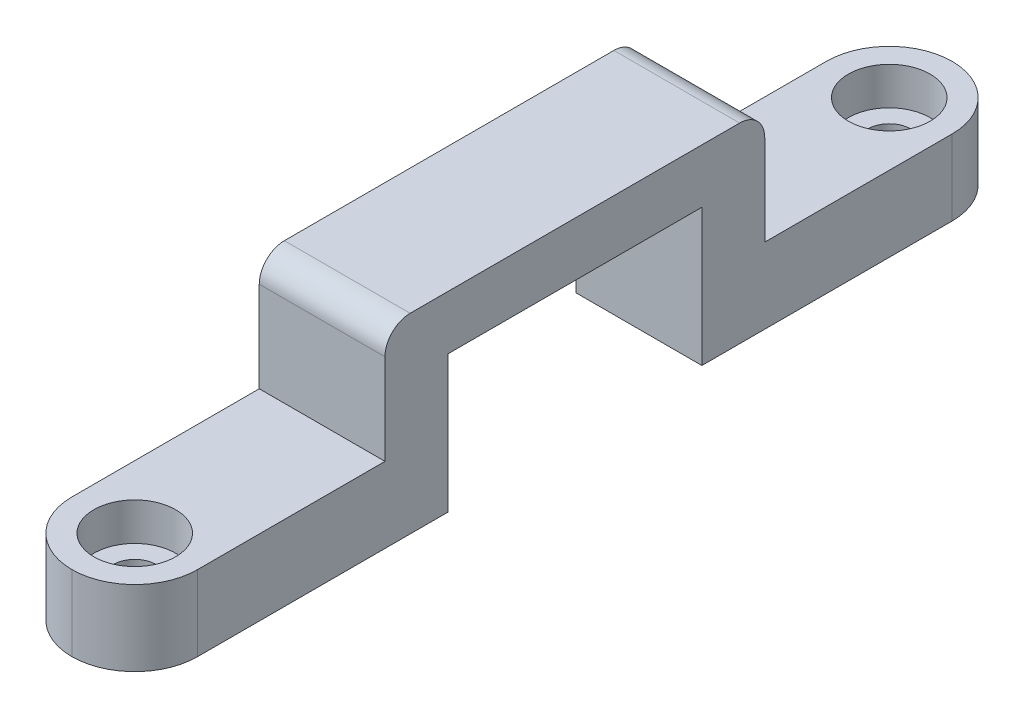
ISO-10303-21;
HEADER;
FILE_DESCRIPTION(('STEP AP214'),'2;1');
FILE_NAME('part.step','',(''),(''),'','','');
FILE_SCHEMA(('AUTOMOTIVE_DESIGN { 1 0 10303 214 1 1 1 1 }'));
ENDSEC;
DATA;
#1=APPLICATION_CONTEXT('core data for automotive mechanical design processes');
#2=APPLICATION_PROTOCOL_DEFINITION('international standard','automotive_design',2000,#1);
#3=PRODUCT_CONTEXT('',#1,'mechanical');
#4=PRODUCT('Part','Part','',(#3));
#5=PRODUCT_RELATED_PRODUCT_CATEGORY('part','',(#4));
#6=PRODUCT_DEFINITION_FORMATION('','',#4);
#7=PRODUCT_DEFINITION_CONTEXT('part definition',#1,'design');
#8=PRODUCT_DEFINITION('design','',#6,#7);
#9=PRODUCT_DEFINITION_SHAPE('','',#8);
#10=(LENGTH_UNIT() NAMED_UNIT(*) SI_UNIT(.MILLI.,.METRE.));
#11=(NAMED_UNIT(*) PLANE_ANGLE_UNIT() SI_UNIT($,.RADIAN.));
#12=(NAMED_UNIT(*) SI_UNIT($,.STERADIAN.) SOLID_ANGLE_UNIT());
#13=UNCERTAINTY_MEASURE_WITH_UNIT(LENGTH_MEASURE(1.E-05),#10,'distance_accuracy_value','');
#14=(GEOMETRIC_REPRESENTATION_CONTEXT(3) GLOBAL_UNCERTAINTY_ASSIGNED_CONTEXT((#13)) GLOBAL_UNIT_ASSIGNED_CONTEXT((#10,
#11,#12)) REPRESENTATION_CONTEXT('',''));
#15=CARTESIAN_POINT('',(0.,0.,0.));
#16=DIRECTION('',(0.,0.,1.));
#17=DIRECTION('',(1.,0.,0.));
#18=AXIS2_PLACEMENT_3D('',#15,#16,#17);
#19=CARTESIAN_POINT('',(10.,0.,-70.));
#20=DIRECTION('',(0.,1.,0.));
#21=DIRECTION('',(0.,0.,1.));
#22=AXIS2_PLACEMENT_3D('',#19,#20,#21);
#23=PLANE('',#22);
#24=CARTESIAN_POINT('',(5.,0.,-5.));
#25=DIRECTION('',(0.,1.,0.));
#26=DIRECTION('',(0.,0.,1.));
#27=AXIS2_PLACEMENT_3D('',#24,#25,#26);
#28=CIRCLE('',#27,1.7);
#29=CARTESIAN_POINT('',(5.,0.,-3.3));
#30=VERTEX_POINT('',#29);
#31=EDGE_CURVE('E222',#30,#30,#28,.T.);
#32=ORIENTED_EDGE('',*,*,#31,.T.);
#33=EDGE_LOOP('',(#32));
#34=FACE_BOUND('',#33,.T.);
#35=DIRECTION('',(0.,0.,-1.));
#36=VECTOR('',#35,1.);
#37=CARTESIAN_POINT('',(10.,0.,-70.));
#38=LINE('',#37,#36);
#39=CARTESIAN_POINT('',(10.,0.,-5.));
#40=VERTEX_POINT('',#39);
#41=CARTESIAN_POINT('',(10.,0.,-24.9));
#42=VERTEX_POINT('',#41);
#43=EDGE_CURVE('E242',#40,#42,#38,.T.);
#44=ORIENTED_EDGE('',*,*,#43,.F.);
#45=CARTESIAN_POINT('',(5.,0.,-5.));
#46=DIRECTION('',(0.,1.,0.));
#47=DIRECTION('',(0.,0.,1.));
#48=AXIS2_PLACEMENT_3D('',#45,#46,#47);
#49=CIRCLE('',#48,5.);
#50=CARTESIAN_POINT('',(5.,0.,0.));
#51=VERTEX_POINT('',#50);
#52=EDGE_CURVE('E295',#40,#51,#49,.F.);
#53=ORIENTED_EDGE('',*,*,#52,.T.);
#54=CARTESIAN_POINT('',(5.,0.,-5.));
#55=DIRECTION('',(0.,1.,0.));
#56=DIRECTION('',(0.,0.,1.));
#57=AXIS2_PLACEMENT_3D('',#54,#55,#56);
#58=CIRCLE('',#57,5.);
#59=CARTESIAN_POINT('',(0.,0.,-5.));
#60=VERTEX_POINT('',#59);
#61=EDGE_CURVE('E160',#51,#60,#58,.F.);
#62=ORIENTED_EDGE('',*,*,#61,.T.);
#63=DIRECTION('',(0.,0.,-1.));
#64=VECTOR('',#63,1.);
#65=CARTESIAN_POINT('',(0.,0.,-70.));
#66=LINE('',#65,#64);
#67=CARTESIAN_POINT('',(0.,0.,-24.9));
#68=VERTEX_POINT('',#67);
#69=EDGE_CURVE('E155',#60,#68,#66,.T.);
#70=ORIENTED_EDGE('',*,*,#69,.T.);
#71=DIRECTION('',(1.,0.,0.));
#72=VECTOR('',#71,1.);
#73=CARTESIAN_POINT('',(0.,0.,-24.9));
#74=LINE('',#73,#72);
#75=EDGE_CURVE('E158',#68,#42,#74,.T.);
#76=ORIENTED_EDGE('',*,*,#75,.T.);
#77=EDGE_LOOP('',(#44,#53,#62,#70,#76));
#78=FACE_BOUND('',#77,.T.);
#79=ADVANCED_FACE('F39',(#34,#78),#23,.F.);
#80=CARTESIAN_POINT('',(5.,0.,-65.));
#81=DIRECTION('',(0.,1.,0.));
#82=DIRECTION('',(0.,0.,1.));
#83=AXIS2_PLACEMENT_3D('',#80,#81,#82);
#84=CIRCLE('',#83,1.7);
#85=CARTESIAN_POINT('',(5.,0.,-63.3));
#86=VERTEX_POINT('',#85);
#87=EDGE_CURVE('E238',#86,#86,#84,.T.);
#88=ORIENTED_EDGE('',*,*,#87,.T.);
#89=EDGE_LOOP('',(#88));
#90=FACE_BOUND('',#89,.T.);
#91=CARTESIAN_POINT('',(5.,0.,-65.));
#92=DIRECTION('',(0.,1.,0.));
#93=DIRECTION('',(0.,0.,1.));
#94=AXIS2_PLACEMENT_3D('',#91,#92,#93);
#95=CIRCLE('',#94,5.);
#96=CARTESIAN_POINT('',(0.,0.,-65.));
#97=VERTEX_POINT('',#96);
#98=CARTESIAN_POINT('',(5.,0.,-70.));
#99=VERTEX_POINT('',#98);
#100=EDGE_CURVE('E316',#97,#99,#95,.F.);
#101=ORIENTED_EDGE('',*,*,#100,.T.);
#102=CARTESIAN_POINT('',(5.,0.,-65.));
#103=DIRECTION('',(0.,1.,0.));
#104=DIRECTION('',(0.,0.,1.));
#105=AXIS2_PLACEMENT_3D('',#102,#103,#104);
#106=CIRCLE('',#105,5.);
#107=CARTESIAN_POINT('',(10.,0.,-65.));
#108=VERTEX_POINT('',#107);
#109=EDGE_CURVE('E319',#99,#108,#106,.F.);
#110=ORIENTED_EDGE('',*,*,#109,.T.);
#111=CARTESIAN_POINT('',(10.,0.,-45.1));
#112=VERTEX_POINT('',#111);
#113=EDGE_CURVE('E246',#112,#108,#38,.T.);
#114=ORIENTED_EDGE('',*,*,#113,.F.);
#115=DIRECTION('',(1.,0.,0.));
#116=VECTOR('',#115,1.);
#117=CARTESIAN_POINT('',(0.,0.,-45.1));
#118=LINE('',#117,#116);
#119=CARTESIAN_POINT('',(0.,0.,-45.1));
#120=VERTEX_POINT('',#119);
#121=EDGE_CURVE('E177',#120,#112,#118,.T.);
#122=ORIENTED_EDGE('',*,*,#121,.F.);
#123=EDGE_CURVE('E166',#120,#97,#66,.T.);
#124=ORIENTED_EDGE('',*,*,#123,.T.);
#125=EDGE_LOOP('',(#101,#110,#114,#122,#124));
#126=FACE_BOUND('',#125,.T.);
#127=ADVANCED_FACE('F382',(#90,#126),#23,.F.);
#128=CARTESIAN_POINT('',(10.,6.,-50.1));
#129=DIRECTION('',(0.,-1.,0.));
#130=DIRECTION('',(0.,0.,-1.));
#131=AXIS2_PLACEMENT_3D('',#128,#129,#130);
#132=PLANE('',#131);
#133=CARTESIAN_POINT('',(5.,6.,-65.));
#134=DIRECTION('',(0.,1.,0.));
#135=DIRECTION('',(0.,0.,1.));
#136=AXIS2_PLACEMENT_3D('',#133,#134,#135);
#137=CIRCLE('',#136,3.25);
#138=CARTESIAN_POINT('',(5.,6.,-61.75));
#139=VERTEX_POINT('',#138);
#140=EDGE_CURVE('E226',#139,#139,#137,.T.);
#141=ORIENTED_EDGE('',*,*,#140,.F.);
#142=EDGE_LOOP('',(#141));
#143=FACE_BOUND('',#142,.T.);
#144=DIRECTION('',(0.,0.,1.));
#145=VECTOR('',#144,1.);
#146=CARTESIAN_POINT('',(10.,6.,-50.1));
#147=LINE('',#146,#145);
#148=CARTESIAN_POINT('',(10.,6.,-65.));
#149=VERTEX_POINT('',#148);
#150=CARTESIAN_POINT('',(10.,6.,-50.1));
#151=VERTEX_POINT('',#150);
#152=EDGE_CURVE('E245',#149,#151,#147,.T.);
#153=ORIENTED_EDGE('',*,*,#152,.F.);
#154=CARTESIAN_POINT('',(5.,6.,-65.));
#155=DIRECTION('',(0.,-1.,0.));
#156=DIRECTION('',(0.,0.,-1.));
#157=AXIS2_PLACEMENT_3D('',#154,#155,#156);
#158=CIRCLE('',#157,5.);
#159=CARTESIAN_POINT('',(5.,6.,-70.));
#160=VERTEX_POINT('',#159);
#161=EDGE_CURVE('E313',#149,#160,#158,.F.);
#162=ORIENTED_EDGE('',*,*,#161,.T.);
#163=CARTESIAN_POINT('',(5.,6.,-65.));
#164=DIRECTION('',(0.,-1.,0.));
#165=DIRECTION('',(0.,0.,-1.));
#166=AXIS2_PLACEMENT_3D('',#163,#164,#165);
#167=CIRCLE('',#166,5.);
#168=CARTESIAN_POINT('',(0.,6.,-65.));
#169=VERTEX_POINT('',#168);
#170=EDGE_CURVE('E310',#160,#169,#167,.F.);
#171=ORIENTED_EDGE('',*,*,#170,.T.);
#172=DIRECTION('',(0.,0.,1.));
#173=VECTOR('',#172,1.);
#174=CARTESIAN_POINT('',(0.,6.,-50.1));
#175=LINE('',#174,#173);
#176=CARTESIAN_POINT('',(0.,6.,-50.1));
#177=VERTEX_POINT('',#176);
#178=EDGE_CURVE('E165',#169,#177,#175,.T.);
#179=ORIENTED_EDGE('',*,*,#178,.T.);
#180=DIRECTION('',(-1.,0.,0.));
#181=VECTOR('',#180,1.);
#182=CARTESIAN_POINT('',(10.,6.,-50.1));
#183=LINE('',#182,#181);
#184=EDGE_CURVE('E281',#151,#177,#183,.T.);
#185=ORIENTED_EDGE('',*,*,#184,.F.);
#186=EDGE_LOOP('',(#153,#162,#171,#179,#185));
#187=FACE_BOUND('',#186,.T.);
#188=ADVANCED_FACE('F371',(#143,#187),#132,.F.);
#189=CARTESIAN_POINT('',(10.,15.2,-50.1));
#190=DIRECTION('',(0.,0.,1.));
#191=DIRECTION('',(1.,0.,0.));
#192=AXIS2_PLACEMENT_3D('',#189,#190,#191);
#193=PLANE('',#192);
#194=DIRECTION('',(0.,1.,0.));
#195=VECTOR('',#194,1.);
#196=CARTESIAN_POINT('',(0.,15.2,-50.1));
#197=LINE('',#196,#195);
#198=CARTESIAN_POINT('',(0.,13.2,-50.1));
#199=VERTEX_POINT('',#198);
#200=EDGE_CURVE('E265',#177,#199,#197,.T.);
#201=ORIENTED_EDGE('',*,*,#200,.T.);
#202=DIRECTION('',(-1.,0.,0.));
#203=VECTOR('',#202,1.);
#204=CARTESIAN_POINT('',(10.,13.2,-50.1));
#205=LINE('',#204,#203);
#206=CARTESIAN_POINT('',(10.,13.2,-50.1));
#207=VERTEX_POINT('',#206);
#208=EDGE_CURVE('E11',#199,#207,#205,.F.);
#209=ORIENTED_EDGE('',*,*,#208,.T.);
#210=DIRECTION('',(0.,1.,0.));
#211=VECTOR('',#210,1.);
#212=CARTESIAN_POINT('',(10.,15.2,-50.1));
#213=LINE('',#212,#211);
#214=EDGE_CURVE('E249',#151,#207,#213,.T.);
#215=ORIENTED_EDGE('',*,*,#214,.F.);
#216=ORIENTED_EDGE('',*,*,#184,.T.);
#217=EDGE_LOOP('',(#201,#209,#215,#216));
#218=FACE_BOUND('',#217,.T.);
#219=ADVANCED_FACE('F367',(#218),#193,.F.);
#220=CARTESIAN_POINT('',(10.,15.2,-19.9));
#221=DIRECTION('',(0.,-1.,0.));
#222=DIRECTION('',(0.,0.,-1.));
#223=AXIS2_PLACEMENT_3D('',#220,#221,#222);
#224=PLANE('',#223);
#225=DIRECTION('',(0.,0.,1.));
#226=VECTOR('',#225,1.);
#227=CARTESIAN_POINT('',(0.,15.2,-19.9));
#228=LINE('',#227,#226);
#229=CARTESIAN_POINT('',(0.,15.2,-48.1));
#230=VERTEX_POINT('',#229);
#231=CARTESIAN_POINT('',(0.,15.2,-21.9));
#232=VERTEX_POINT('',#231);
#233=EDGE_CURVE('E268',#230,#232,#228,.T.);
#234=ORIENTED_EDGE('',*,*,#233,.T.);
#235=DIRECTION('',(-1.,0.,0.));
#236=VECTOR('',#235,1.);
#237=CARTESIAN_POINT('',(10.,15.2,-21.9));
#238=LINE('',#237,#236);
#239=CARTESIAN_POINT('',(10.,15.2,-21.9));
#240=VERTEX_POINT('',#239);
#241=EDGE_CURVE('E61',#232,#240,#238,.F.);
#242=ORIENTED_EDGE('',*,*,#241,.T.);
#243=DIRECTION('',(0.,0.,1.));
#244=VECTOR('',#243,1.);
#245=CARTESIAN_POINT('',(10.,15.2,-19.9));
#246=LINE('',#245,#244);
#247=CARTESIAN_POINT('',(10.,15.2,-48.1));
#248=VERTEX_POINT('',#247);
#249=EDGE_CURVE('E252',#248,#240,#246,.T.);
#250=ORIENTED_EDGE('',*,*,#249,.F.);
#251=DIRECTION('',(-1.,0.,0.));
#252=VECTOR('',#251,1.);
#253=CARTESIAN_POINT('',(10.,15.2,-48.1));
#254=LINE('',#253,#252);
#255=EDGE_CURVE('E339',#248,#230,#254,.T.);
#256=ORIENTED_EDGE('',*,*,#255,.T.);
#257=EDGE_LOOP('',(#234,#242,#250,#256));
#258=FACE_BOUND('',#257,.T.);
#259=ADVANCED_FACE('F361',(#258),#224,.F.);
#260=CARTESIAN_POINT('',(10.,6.,-19.9));
#261=DIRECTION('',(0.,0.,-1.));
#262=DIRECTION('',(-1.,0.,0.));
#263=AXIS2_PLACEMENT_3D('',#260,#261,#262);
#264=PLANE('',#263);
#265=DIRECTION('',(0.,-1.,0.));
#266=VECTOR('',#265,1.);
#267=CARTESIAN_POINT('',(10.,6.,-19.9));
#268=LINE('',#267,#266);
#269=CARTESIAN_POINT('',(10.,13.2,-19.9));
#270=VERTEX_POINT('',#269);
#271=CARTESIAN_POINT('',(10.,6.,-19.9));
#272=VERTEX_POINT('',#271);
#273=EDGE_CURVE('E255',#270,#272,#268,.T.);
#274=ORIENTED_EDGE('',*,*,#273,.F.);
#275=DIRECTION('',(-1.,0.,0.));
#276=VECTOR('',#275,1.);
#277=CARTESIAN_POINT('',(10.,13.2,-19.9));
#278=LINE('',#277,#276);
#279=CARTESIAN_POINT('',(0.,13.2,-19.9));
#280=VERTEX_POINT('',#279);
#281=EDGE_CURVE('E322',#270,#280,#278,.T.);
#282=ORIENTED_EDGE('',*,*,#281,.T.);
#283=DIRECTION('',(0.,-1.,0.));
#284=VECTOR('',#283,1.);
#285=CARTESIAN_POINT('',(0.,6.,-19.9));
#286=LINE('',#285,#284);
#287=CARTESIAN_POINT('',(0.,6.,-19.9));
#288=VERTEX_POINT('',#287);
#289=EDGE_CURVE('E271',#280,#288,#286,.T.);
#290=ORIENTED_EDGE('',*,*,#289,.T.);
#291=DIRECTION('',(-1.,0.,0.));
#292=VECTOR('',#291,1.);
#293=CARTESIAN_POINT('',(10.,6.,-19.9));
#294=LINE('',#293,#292);
#295=EDGE_CURVE('E261',#272,#288,#294,.T.);
#296=ORIENTED_EDGE('',*,*,#295,.F.);
#297=EDGE_LOOP('',(#274,#282,#290,#296));
#298=FACE_BOUND('',#297,.T.);
#299=ADVANCED_FACE('F356',(#298),#264,.F.);
#300=CARTESIAN_POINT('',(10.,6.,0.));
#301=DIRECTION('',(0.,-1.,0.));
#302=DIRECTION('',(0.,0.,-1.));
#303=AXIS2_PLACEMENT_3D('',#300,#301,#302);
#304=PLANE('',#303);
#305=CARTESIAN_POINT('',(5.,6.,-5.));
#306=DIRECTION('',(0.,1.,0.));
#307=DIRECTION('',(0.,0.,1.));
#308=AXIS2_PLACEMENT_3D('',#305,#306,#307);
#309=CIRCLE('',#308,3.25);
#310=CARTESIAN_POINT('',(5.,6.,-1.75));
#311=VERTEX_POINT('',#310);
#312=EDGE_CURVE('E205',#311,#311,#309,.T.);
#313=ORIENTED_EDGE('',*,*,#312,.F.);
#314=EDGE_LOOP('',(#313));
#315=FACE_BOUND('',#314,.T.);
#316=CARTESIAN_POINT('',(5.,6.,-5.));
#317=DIRECTION('',(0.,-1.,0.));
#318=DIRECTION('',(0.,0.,-1.));
#319=AXIS2_PLACEMENT_3D('',#316,#317,#318);
#320=CIRCLE('',#319,5.);
#321=CARTESIAN_POINT('',(0.,6.,-5.));
#322=VERTEX_POINT('',#321);
#323=CARTESIAN_POINT('',(5.,6.,0.));
#324=VERTEX_POINT('',#323);
#325=EDGE_CURVE('E298',#322,#324,#320,.F.);
#326=ORIENTED_EDGE('',*,*,#325,.T.);
#327=CARTESIAN_POINT('',(5.,6.,-5.));
#328=DIRECTION('',(0.,-1.,0.));
#329=DIRECTION('',(0.,0.,-1.));
#330=AXIS2_PLACEMENT_3D('',#327,#328,#329);
#331=CIRCLE('',#330,5.);
#332=CARTESIAN_POINT('',(10.,6.,-5.));
#333=VERTEX_POINT('',#332);
#334=EDGE_CURVE('E301',#324,#333,#331,.F.);
#335=ORIENTED_EDGE('',*,*,#334,.T.);
#336=DIRECTION('',(0.,0.,1.));
#337=VECTOR('',#336,1.);
#338=CARTESIAN_POINT('',(10.,6.,0.));
#339=LINE('',#338,#337);
#340=EDGE_CURVE('E258',#272,#333,#339,.T.);
#341=ORIENTED_EDGE('',*,*,#340,.F.);
#342=ORIENTED_EDGE('',*,*,#295,.T.);
#343=DIRECTION('',(0.,0.,1.));
#344=VECTOR('',#343,1.);
#345=CARTESIAN_POINT('',(0.,6.,0.));
#346=LINE('',#345,#344);
#347=EDGE_CURVE('E274',#288,#322,#346,.T.);
#348=ORIENTED_EDGE('',*,*,#347,.T.);
#349=EDGE_LOOP('',(#326,#335,#341,#342,#348));
#350=FACE_BOUND('',#349,.T.);
#351=ADVANCED_FACE('F429',(#315,#350),#304,.F.);
#352=CARTESIAN_POINT('',(10.,0.,0.));
#353=DIRECTION('',(-1.,0.,0.));
#354=DIRECTION('',(0.,0.,1.));
#355=AXIS2_PLACEMENT_3D('',#352,#353,#354);
#356=PLANE('',#355);
#357=ORIENTED_EDGE('',*,*,#249,.T.);
#358=CARTESIAN_POINT('',(10.,13.2,-21.9));
#359=DIRECTION('',(-1.,0.,0.));
#360=DIRECTION('',(0.,0.,1.));
#361=AXIS2_PLACEMENT_3D('',#358,#359,#360);
#362=CIRCLE('',#361,2.);
#363=EDGE_CURVE('E48',#240,#270,#362,.F.);
#364=ORIENTED_EDGE('',*,*,#363,.T.);
#365=ORIENTED_EDGE('',*,*,#273,.T.);
#366=ORIENTED_EDGE('',*,*,#340,.T.);
#367=DIRECTION('',(0.,-1.,0.));
#368=VECTOR('',#367,1.);
#369=CARTESIAN_POINT('',(10.,0.,-5.));
#370=LINE('',#369,#368);
#371=EDGE_CURVE('E289',#333,#40,#370,.T.);
#372=ORIENTED_EDGE('',*,*,#371,.T.);
#373=ORIENTED_EDGE('',*,*,#43,.T.);
#374=DIRECTION('',(0.,-1.,0.));
#375=VECTOR('',#374,1.);
#376=CARTESIAN_POINT('',(10.,0.,-24.9));
#377=LINE('',#376,#375);
#378=CARTESIAN_POINT('',(10.,10.9,-24.9));
#379=VERTEX_POINT('',#378);
#380=EDGE_CURVE('E175',#379,#42,#377,.T.);
#381=ORIENTED_EDGE('',*,*,#380,.F.);
#382=DIRECTION('',(0.,0.,1.));
#383=VECTOR('',#382,1.);
#384=CARTESIAN_POINT('',(10.,10.9,-24.9));
#385=LINE('',#384,#383);
#386=CARTESIAN_POINT('',(10.,10.9,-45.1));
#387=VERTEX_POINT('',#386);
#388=EDGE_CURVE('E185',#387,#379,#385,.T.);
#389=ORIENTED_EDGE('',*,*,#388,.F.);
#390=DIRECTION('',(0.,1.,0.));
#391=VECTOR('',#390,1.);
#392=CARTESIAN_POINT('',(10.,0.,-45.1));
#393=LINE('',#392,#391);
#394=EDGE_CURVE('E191',#112,#387,#393,.T.);
#395=ORIENTED_EDGE('',*,*,#394,.F.);
#396=ORIENTED_EDGE('',*,*,#113,.T.);
#397=DIRECTION('',(0.,1.,0.));
#398=VECTOR('',#397,1.);
#399=CARTESIAN_POINT('',(10.,0.,-65.));
#400=LINE('',#399,#398);
#401=EDGE_CURVE('E285',#108,#149,#400,.T.);
#402=ORIENTED_EDGE('',*,*,#401,.T.);
#403=ORIENTED_EDGE('',*,*,#152,.T.);
#404=ORIENTED_EDGE('',*,*,#214,.T.);
#405=CARTESIAN_POINT('',(10.,13.2,-48.1));
#406=DIRECTION('',(-1.,0.,0.));
#407=DIRECTION('',(0.,0.,1.));
#408=AXIS2_PLACEMENT_3D('',#405,#406,#407);
#409=CIRCLE('',#408,2.);
#410=EDGE_CURVE('E345',#207,#248,#409,.F.);
#411=ORIENTED_EDGE('',*,*,#410,.T.);
#412=EDGE_LOOP('',(#357,#364,#365,#366,#372,#373,#381,#389,#395,#396,#402,#403,#404,#411));
#413=FACE_BOUND('',#412,.T.);
#414=ADVANCED_FACE('F351',(#413),#356,.F.);
#415=CARTESIAN_POINT('',(0.,0.,0.));
#416=DIRECTION('',(-1.,0.,0.));
#417=DIRECTION('',(0.,0.,1.));
#418=AXIS2_PLACEMENT_3D('',#415,#416,#417);
#419=PLANE('',#418);
#420=ORIENTED_EDGE('',*,*,#289,.F.);
#421=CARTESIAN_POINT('',(0.,13.2,-21.9));
#422=DIRECTION('',(-1.,0.,0.));
#423=DIRECTION('',(0.,0.,1.));
#424=AXIS2_PLACEMENT_3D('',#421,#422,#423);
#425=CIRCLE('',#424,2.);
#426=EDGE_CURVE('E336',#280,#232,#425,.T.);
#427=ORIENTED_EDGE('',*,*,#426,.T.);
#428=ORIENTED_EDGE('',*,*,#233,.F.);
#429=CARTESIAN_POINT('',(0.,13.2,-48.1));
#430=DIRECTION('',(-1.,0.,0.));
#431=DIRECTION('',(0.,0.,1.));
#432=AXIS2_PLACEMENT_3D('',#429,#430,#431);
#433=CIRCLE('',#432,2.);
#434=EDGE_CURVE('E333',#230,#199,#433,.T.);
#435=ORIENTED_EDGE('',*,*,#434,.T.);
#436=ORIENTED_EDGE('',*,*,#200,.F.);
#437=ORIENTED_EDGE('',*,*,#178,.F.);
#438=DIRECTION('',(0.,1.,0.));
#439=VECTOR('',#438,1.);
#440=CARTESIAN_POINT('',(0.,0.,-65.));
#441=LINE('',#440,#439);
#442=EDGE_CURVE('E304',#169,#97,#441,.F.);
#443=ORIENTED_EDGE('',*,*,#442,.T.);
#444=ORIENTED_EDGE('',*,*,#123,.F.);
#445=DIRECTION('',(0.,1.,0.));
#446=VECTOR('',#445,1.);
#447=CARTESIAN_POINT('',(0.,0.,-45.1));
#448=LINE('',#447,#446);
#449=CARTESIAN_POINT('',(0.,10.9,-45.1));
#450=VERTEX_POINT('',#449);
#451=EDGE_CURVE('E184',#120,#450,#448,.T.);
#452=ORIENTED_EDGE('',*,*,#451,.T.);
#453=DIRECTION('',(0.,0.,1.));
#454=VECTOR('',#453,1.);
#455=CARTESIAN_POINT('',(0.,10.9,-24.9));
#456=LINE('',#455,#454);
#457=CARTESIAN_POINT('',(0.,10.9,-24.9));
#458=VERTEX_POINT('',#457);
#459=EDGE_CURVE('E178',#450,#458,#456,.T.);
#460=ORIENTED_EDGE('',*,*,#459,.T.);
#461=DIRECTION('',(0.,-1.,0.));
#462=VECTOR('',#461,1.);
#463=CARTESIAN_POINT('',(0.,0.,-24.9));
#464=LINE('',#463,#462);
#465=EDGE_CURVE('E172',#458,#68,#464,.T.);
#466=ORIENTED_EDGE('',*,*,#465,.T.);
#467=ORIENTED_EDGE('',*,*,#69,.F.);
#468=DIRECTION('',(0.,-1.,0.));
#469=VECTOR('',#468,1.);
#470=CARTESIAN_POINT('',(0.,6.,-5.));
#471=LINE('',#470,#469);
#472=EDGE_CURVE('E307',#60,#322,#471,.F.);
#473=ORIENTED_EDGE('',*,*,#472,.T.);
#474=ORIENTED_EDGE('',*,*,#347,.F.);
#475=EDGE_LOOP('',(#420,#427,#428,#435,#436,#437,#443,#444,#452,#460,#466,#467,#473,#474));
#476=FACE_BOUND('',#475,.T.);
#477=ADVANCED_FACE('F181',(#476),#419,.T.);
#478=CARTESIAN_POINT('',(5.,6.,-65.));
#479=DIRECTION('',(0.,1.,0.));
#480=DIRECTION('',(0.,0.,1.));
#481=AXIS2_PLACEMENT_3D('',#478,#479,#480);
#482=CYLINDRICAL_SURFACE('',#481,1.7);
#483=ORIENTED_EDGE('',*,*,#87,.F.);
#484=EDGE_LOOP('',(#483));
#485=FACE_BOUND('',#484,.T.);
#486=CARTESIAN_POINT('',(5.,3.,-65.));
#487=DIRECTION('',(0.,1.,0.));
#488=DIRECTION('',(0.,0.,1.));
#489=AXIS2_PLACEMENT_3D('',#486,#487,#488);
#490=CIRCLE('',#489,1.7);
#491=CARTESIAN_POINT('',(5.,3.,-63.3));
#492=VERTEX_POINT('',#491);
#493=EDGE_CURVE('E234',#492,#492,#490,.T.);
#494=ORIENTED_EDGE('',*,*,#493,.T.);
#495=EDGE_LOOP('',(#494));
#496=FACE_BOUND('',#495,.T.);
#497=ADVANCED_FACE('F458',(#485,#496),#482,.F.);
#498=CARTESIAN_POINT('',(6.7,3.,-65.));
#499=DIRECTION('',(0.,-1.,0.));
#500=DIRECTION('',(0.,0.,-1.));
#501=AXIS2_PLACEMENT_3D('',#498,#499,#500);
#502=PLANE('',#501);
#503=ORIENTED_EDGE('',*,*,#493,.F.);
#504=EDGE_LOOP('',(#503));
#505=FACE_BOUND('',#504,.T.);
#506=CARTESIAN_POINT('',(5.,3.,-65.));
#507=DIRECTION('',(0.,1.,0.));
#508=DIRECTION('',(0.,0.,1.));
#509=AXIS2_PLACEMENT_3D('',#506,#507,#508);
#510=CIRCLE('',#509,3.25);
#511=CARTESIAN_POINT('',(5.,3.,-61.75));
#512=VERTEX_POINT('',#511);
#513=EDGE_CURVE('E230',#512,#512,#510,.T.);
#514=ORIENTED_EDGE('',*,*,#513,.T.);
#515=EDGE_LOOP('',(#514));
#516=FACE_BOUND('',#515,.T.);
#517=ADVANCED_FACE('F454',(#505,#516),#502,.F.);
#518=CARTESIAN_POINT('',(5.,6.,-65.));
#519=DIRECTION('',(0.,1.,0.));
#520=DIRECTION('',(0.,0.,1.));
#521=AXIS2_PLACEMENT_3D('',#518,#519,#520);
#522=CYLINDRICAL_SURFACE('',#521,3.25);
#523=ORIENTED_EDGE('',*,*,#513,.F.);
#524=EDGE_LOOP('',(#523));
#525=FACE_BOUND('',#524,.T.);
#526=ORIENTED_EDGE('',*,*,#140,.T.);
#527=EDGE_LOOP('',(#526));
#528=FACE_BOUND('',#527,.T.);
#529=ADVANCED_FACE('F450',(#525,#528),#522,.F.);
#530=CARTESIAN_POINT('',(5.,6.,-5.));
#531=DIRECTION('',(0.,1.,0.));
#532=DIRECTION('',(0.,0.,1.));
#533=AXIS2_PLACEMENT_3D('',#530,#531,#532);
#534=CYLINDRICAL_SURFACE('',#533,1.7);
#535=ORIENTED_EDGE('',*,*,#31,.F.);
#536=EDGE_LOOP('',(#535));
#537=FACE_BOUND('',#536,.T.);
#538=CARTESIAN_POINT('',(5.,3.,-5.));
#539=DIRECTION('',(0.,1.,0.));
#540=DIRECTION('',(0.,0.,1.));
#541=AXIS2_PLACEMENT_3D('',#538,#539,#540);
#542=CIRCLE('',#541,1.7);
#543=CARTESIAN_POINT('',(5.,3.,-3.3));
#544=VERTEX_POINT('',#543);
#545=EDGE_CURVE('E218',#544,#544,#542,.T.);
#546=ORIENTED_EDGE('',*,*,#545,.T.);
#547=EDGE_LOOP('',(#546));
#548=FACE_BOUND('',#547,.T.);
#549=ADVANCED_FACE('F446',(#537,#548),#534,.F.);
#550=CARTESIAN_POINT('',(6.7,3.,-5.));
#551=DIRECTION('',(0.,-1.,0.));
#552=DIRECTION('',(0.,0.,-1.));
#553=AXIS2_PLACEMENT_3D('',#550,#551,#552);
#554=PLANE('',#553);
#555=ORIENTED_EDGE('',*,*,#545,.F.);
#556=EDGE_LOOP('',(#555));
#557=FACE_BOUND('',#556,.T.);
#558=CARTESIAN_POINT('',(5.,3.,-5.));
#559=DIRECTION('',(0.,1.,0.));
#560=DIRECTION('',(0.,0.,1.));
#561=AXIS2_PLACEMENT_3D('',#558,#559,#560);
#562=CIRCLE('',#561,3.25);
#563=CARTESIAN_POINT('',(5.,3.,-1.75));
#564=VERTEX_POINT('',#563);
#565=EDGE_CURVE('E214',#564,#564,#562,.T.);
#566=ORIENTED_EDGE('',*,*,#565,.T.);
#567=EDGE_LOOP('',(#566));
#568=FACE_BOUND('',#567,.T.);
#569=ADVANCED_FACE('F442',(#557,#568),#554,.F.);
#570=CARTESIAN_POINT('',(5.,6.,-5.));
#571=DIRECTION('',(0.,1.,0.));
#572=DIRECTION('',(0.,0.,1.));
#573=AXIS2_PLACEMENT_3D('',#570,#571,#572);
#574=CYLINDRICAL_SURFACE('',#573,3.25);
#575=ORIENTED_EDGE('',*,*,#565,.F.);
#576=EDGE_LOOP('',(#575));
#577=FACE_BOUND('',#576,.T.);
#578=ORIENTED_EDGE('',*,*,#312,.T.);
#579=EDGE_LOOP('',(#578));
#580=FACE_BOUND('',#579,.T.);
#581=ADVANCED_FACE('F437',(#577,#580),#574,.F.);
#582=CARTESIAN_POINT('',(0.,0.,-24.9));
#583=DIRECTION('',(0.,0.,1.));
#584=DIRECTION('',(1.,0.,0.));
#585=AXIS2_PLACEMENT_3D('',#582,#583,#584);
#586=PLANE('',#585);
#587=ORIENTED_EDGE('',*,*,#380,.T.);
#588=ORIENTED_EDGE('',*,*,#75,.F.);
#589=ORIENTED_EDGE('',*,*,#465,.F.);
#590=DIRECTION('',(1.,0.,0.));
#591=VECTOR('',#590,1.);
#592=CARTESIAN_POINT('',(0.,10.9,-24.9));
#593=LINE('',#592,#591);
#594=EDGE_CURVE('E202',#458,#379,#593,.T.);
#595=ORIENTED_EDGE('',*,*,#594,.T.);
#596=EDGE_LOOP('',(#587,#588,#589,#595));
#597=FACE_BOUND('',#596,.T.);
#598=ADVANCED_FACE('F171',(#597),#586,.F.);
#599=CARTESIAN_POINT('',(0.,10.9,-24.9));
#600=DIRECTION('',(0.,1.,0.));
#601=DIRECTION('',(0.,0.,1.));
#602=AXIS2_PLACEMENT_3D('',#599,#600,#601);
#603=PLANE('',#602);
#604=ORIENTED_EDGE('',*,*,#388,.T.);
#605=ORIENTED_EDGE('',*,*,#594,.F.);
#606=ORIENTED_EDGE('',*,*,#459,.F.);
#607=DIRECTION('',(1.,0.,0.));
#608=VECTOR('',#607,1.);
#609=CARTESIAN_POINT('',(0.,10.9,-45.1));
#610=LINE('',#609,#608);
#611=EDGE_CURVE('E206',#450,#387,#610,.T.);
#612=ORIENTED_EDGE('',*,*,#611,.T.);
#613=EDGE_LOOP('',(#604,#605,#606,#612));
#614=FACE_BOUND('',#613,.T.);
#615=ADVANCED_FACE('F421',(#614),#603,.F.);
#616=CARTESIAN_POINT('',(0.,0.,-45.1));
#617=DIRECTION('',(0.,0.,-1.));
#618=DIRECTION('',(0.,1.,0.));
#619=AXIS2_PLACEMENT_3D('',#616,#617,#618);
#620=PLANE('',#619);
#621=ORIENTED_EDGE('',*,*,#394,.T.);
#622=ORIENTED_EDGE('',*,*,#611,.F.);
#623=ORIENTED_EDGE('',*,*,#451,.F.);
#624=ORIENTED_EDGE('',*,*,#121,.T.);
#625=EDGE_LOOP('',(#621,#622,#623,#624));
#626=FACE_BOUND('',#625,.T.);
#627=ADVANCED_FACE('F416',(#626),#620,.F.);
#628=CARTESIAN_POINT('',(5.,0.,-5.));
#629=DIRECTION('',(0.,1.,0.));
#630=DIRECTION('',(0.,0.,1.));
#631=AXIS2_PLACEMENT_3D('',#628,#629,#630);
#632=CYLINDRICAL_SURFACE('',#631,5.);
#633=DIRECTION('',(0.,-1.,0.));
#634=VECTOR('',#633,1.);
#635=CARTESIAN_POINT('',(5.,0.,0.));
#636=LINE('',#635,#634);
#637=EDGE_CURVE('E198',#324,#51,#636,.T.);
#638=ORIENTED_EDGE('',*,*,#637,.F.);
#639=ORIENTED_EDGE('',*,*,#325,.F.);
#640=ORIENTED_EDGE('',*,*,#472,.F.);
#641=ORIENTED_EDGE('',*,*,#61,.F.);
#642=EDGE_LOOP('',(#638,#639,#640,#641));
#643=FACE_BOUND('',#642,.T.);
#644=ADVANCED_FACE('F413',(#643),#632,.T.);
#645=CARTESIAN_POINT('',(5.,0.,-5.));
#646=DIRECTION('',(0.,-1.,0.));
#647=DIRECTION('',(0.,0.,-1.));
#648=AXIS2_PLACEMENT_3D('',#645,#646,#647);
#649=CYLINDRICAL_SURFACE('',#648,5.);
#650=ORIENTED_EDGE('',*,*,#334,.F.);
#651=ORIENTED_EDGE('',*,*,#637,.T.);
#652=ORIENTED_EDGE('',*,*,#52,.F.);
#653=ORIENTED_EDGE('',*,*,#371,.F.);
#654=EDGE_LOOP('',(#650,#651,#652,#653));
#655=FACE_BOUND('',#654,.T.);
#656=ADVANCED_FACE('F399',(#655),#649,.T.);
#657=CARTESIAN_POINT('',(5.,6.,-65.));
#658=DIRECTION('',(0.,-1.,0.));
#659=DIRECTION('',(0.,0.,-1.));
#660=AXIS2_PLACEMENT_3D('',#657,#658,#659);
#661=CYLINDRICAL_SURFACE('',#660,5.);
#662=DIRECTION('',(0.,1.,0.));
#663=VECTOR('',#662,1.);
#664=CARTESIAN_POINT('',(5.,6.,-70.));
#665=LINE('',#664,#663);
#666=EDGE_CURVE('E326',#99,#160,#665,.T.);
#667=ORIENTED_EDGE('',*,*,#666,.F.);
#668=ORIENTED_EDGE('',*,*,#100,.F.);
#669=ORIENTED_EDGE('',*,*,#442,.F.);
#670=ORIENTED_EDGE('',*,*,#170,.F.);
#671=EDGE_LOOP('',(#667,#668,#669,#670));
#672=FACE_BOUND('',#671,.T.);
#673=ADVANCED_FACE('F379',(#672),#661,.T.);
#674=CARTESIAN_POINT('',(5.,0.,-65.));
#675=DIRECTION('',(0.,1.,0.));
#676=DIRECTION('',(0.,0.,1.));
#677=AXIS2_PLACEMENT_3D('',#674,#675,#676);
#678=CYLINDRICAL_SURFACE('',#677,5.);
#679=ORIENTED_EDGE('',*,*,#109,.F.);
#680=ORIENTED_EDGE('',*,*,#666,.T.);
#681=ORIENTED_EDGE('',*,*,#161,.F.);
#682=ORIENTED_EDGE('',*,*,#401,.F.);
#683=EDGE_LOOP('',(#679,#680,#681,#682));
#684=FACE_BOUND('',#683,.T.);
#685=ADVANCED_FACE('F392',(#684),#678,.T.);
#686=CARTESIAN_POINT('',(10.,13.2,-21.9));
#687=DIRECTION('',(-1.,0.,0.));
#688=DIRECTION('',(0.,0.,1.));
#689=AXIS2_PLACEMENT_3D('',#686,#687,#688);
#690=CYLINDRICAL_SURFACE('',#689,2.);
#691=ORIENTED_EDGE('',*,*,#363,.F.);
#692=ORIENTED_EDGE('',*,*,#241,.F.);
#693=ORIENTED_EDGE('',*,*,#426,.F.);
#694=ORIENTED_EDGE('',*,*,#281,.F.);
#695=EDGE_LOOP('',(#691,#692,#693,#694));
#696=FACE_BOUND('',#695,.T.);
#697=ADVANCED_FACE('F358',(#696),#690,.T.);
#698=CARTESIAN_POINT('',(10.,13.2,-48.1));
#699=DIRECTION('',(-1.,0.,0.));
#700=DIRECTION('',(0.,0.,1.));
#701=AXIS2_PLACEMENT_3D('',#698,#699,#700);
#702=CYLINDRICAL_SURFACE('',#701,2.);
#703=ORIENTED_EDGE('',*,*,#410,.F.);
#704=ORIENTED_EDGE('',*,*,#208,.F.);
#705=ORIENTED_EDGE('',*,*,#434,.F.);
#706=ORIENTED_EDGE('',*,*,#255,.F.);
#707=EDGE_LOOP('',(#703,#704,#705,#706));
#708=FACE_BOUND('',#707,.T.);
#709=ADVANCED_FACE('F41',(#708),#702,.T.);
#710=CLOSED_SHELL('',(#79,#127,#188,#219,#259,#299,#351,#414,#477,#497,#517,#529,#549,#569,#581,
#598,#615,#627,#644,#656,#673,#685,#697,#709));
#711=MANIFOLD_SOLID_BREP('B2',#710);
#712=ADVANCED_BREP_SHAPE_REPRESENTATION('',(#18,#711),#14);
#713=SHAPE_DEFINITION_REPRESENTATION(#9,#712);
ENDSEC;
END-ISO-10303-21;
